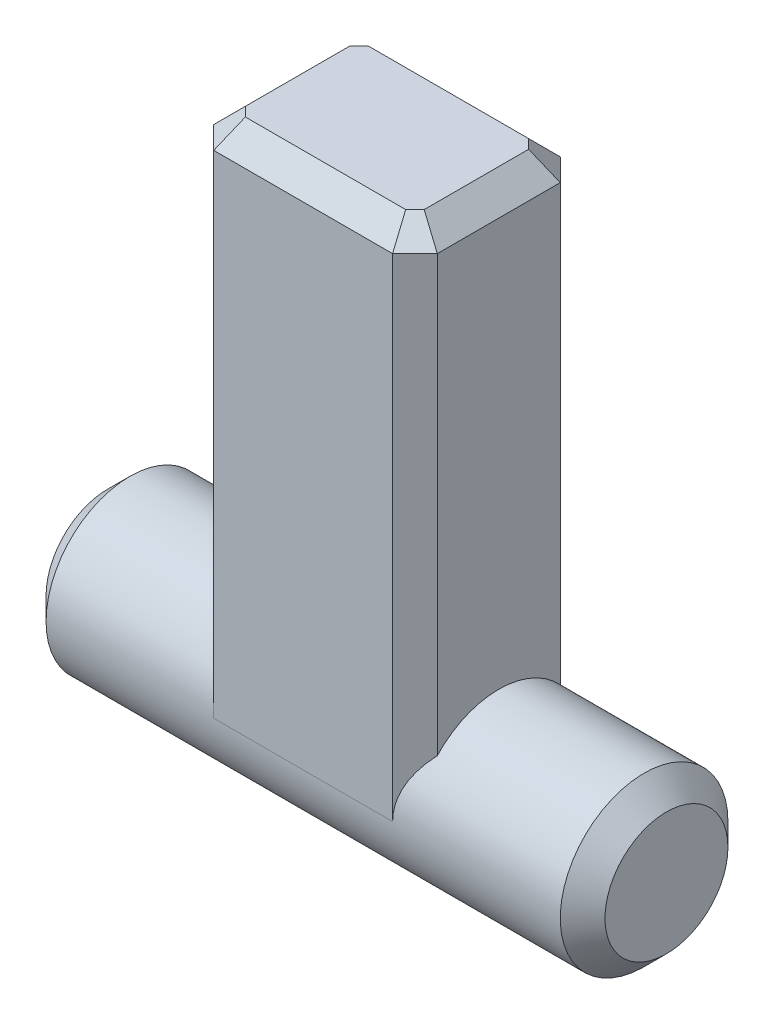
ISO-10303-21;
HEADER;
FILE_DESCRIPTION(('STEP AP214'),'2;1');
FILE_NAME('part.step','',(''),(''),'','','');
FILE_SCHEMA(('AUTOMOTIVE_DESIGN { 1 0 10303 214 1 1 1 1 }'));
ENDSEC;
DATA;
#1=APPLICATION_CONTEXT('core data for automotive mechanical design processes');
#2=APPLICATION_PROTOCOL_DEFINITION('international standard','automotive_design',2000,#1);
#3=PRODUCT_CONTEXT('',#1,'mechanical');
#4=PRODUCT('Part','Part','',(#3));
#5=PRODUCT_RELATED_PRODUCT_CATEGORY('part','',(#4));
#6=PRODUCT_DEFINITION_FORMATION('','',#4);
#7=PRODUCT_DEFINITION_CONTEXT('part definition',#1,'design');
#8=PRODUCT_DEFINITION('design','',#6,#7);
#9=PRODUCT_DEFINITION_SHAPE('','',#8);
#10=(LENGTH_UNIT() NAMED_UNIT(*) SI_UNIT(.MILLI.,.METRE.));
#11=(NAMED_UNIT(*) PLANE_ANGLE_UNIT() SI_UNIT($,.RADIAN.));
#12=(NAMED_UNIT(*) SI_UNIT($,.STERADIAN.) SOLID_ANGLE_UNIT());
#13=UNCERTAINTY_MEASURE_WITH_UNIT(LENGTH_MEASURE(1.E-05),#10,'distance_accuracy_value','');
#14=(GEOMETRIC_REPRESENTATION_CONTEXT(3) GLOBAL_UNCERTAINTY_ASSIGNED_CONTEXT((#13)) GLOBAL_UNIT_ASSIGNED_CONTEXT((#10,
#11,#12)) REPRESENTATION_CONTEXT('',''));
#15=CARTESIAN_POINT('',(0.,0.,0.));
#16=DIRECTION('',(0.,0.,1.));
#17=DIRECTION('',(1.,0.,0.));
#18=AXIS2_PLACEMENT_3D('',#15,#16,#17);
#19=CARTESIAN_POINT('',(-2.,0.,44.5));
#20=DIRECTION('',(0.,0.,-1.));
#21=DIRECTION('',(-1.,0.,0.));
#22=AXIS2_PLACEMENT_3D('',#19,#20,#21);
#23=PLANE('',#22);
#24=DIRECTION('',(0.,1.,0.));
#25=VECTOR('',#24,1.);
#26=CARTESIAN_POINT('',(1.60000000000001,6.2,44.5));
#27=LINE('',#26,#25);
#28=CARTESIAN_POINT('',(1.60000000000001,-3.,44.5));
#29=VERTEX_POINT('',#28);
#30=CARTESIAN_POINT('',(1.60000000000001,5.8,44.5));
#31=VERTEX_POINT('',#30);
#32=EDGE_CURVE('E152',#29,#31,#27,.T.);
#33=ORIENTED_EDGE('',*,*,#32,.T.);
#34=DIRECTION('',(-1.,0.,0.));
#35=VECTOR('',#34,1.);
#36=CARTESIAN_POINT('',(-1.6,5.8,44.5));
#37=LINE('',#36,#35);
#38=CARTESIAN_POINT('',(-1.6,5.8,44.5));
#39=VERTEX_POINT('',#38);
#40=EDGE_CURVE('E146',#31,#39,#37,.T.);
#41=ORIENTED_EDGE('',*,*,#40,.T.);
#42=DIRECTION('',(0.,-1.,0.));
#43=VECTOR('',#42,1.);
#44=CARTESIAN_POINT('',(-1.6,0.,44.5));
#45=LINE('',#44,#43);
#46=CARTESIAN_POINT('',(-1.6,-3.,44.5));
#47=VERTEX_POINT('',#46);
#48=EDGE_CURVE('E142',#39,#47,#45,.T.);
#49=ORIENTED_EDGE('',*,*,#48,.T.);
#50=DIRECTION('',(1.,0.,0.));
#51=VECTOR('',#50,1.);
#52=CARTESIAN_POINT('',(-2.,-3.,44.5));
#53=LINE('',#52,#51);
#54=EDGE_CURVE('E144',#47,#29,#53,.T.);
#55=ORIENTED_EDGE('',*,*,#54,.T.);
#56=EDGE_LOOP('',(#33,#41,#49,#55));
#57=FACE_BOUND('',#56,.T.);
#58=ADVANCED_FACE('F49',(#57),#23,.F.);
#59=CARTESIAN_POINT('',(-2.,0.,41.5));
#60=DIRECTION('',(0.,0.,-1.));
#61=DIRECTION('',(-1.,0.,0.));
#62=AXIS2_PLACEMENT_3D('',#59,#60,#61);
#63=PLANE('',#62);
#64=DIRECTION('',(0.,1.,0.));
#65=VECTOR('',#64,1.);
#66=CARTESIAN_POINT('',(-1.60000000000001,6.2,41.5));
#67=LINE('',#66,#65);
#68=CARTESIAN_POINT('',(-1.60000000000001,-3.,41.5));
#69=VERTEX_POINT('',#68);
#70=CARTESIAN_POINT('',(-1.60000000000001,5.8,41.5));
#71=VERTEX_POINT('',#70);
#72=EDGE_CURVE('E179',#69,#71,#67,.T.);
#73=ORIENTED_EDGE('',*,*,#72,.T.);
#74=DIRECTION('',(1.,0.,0.));
#75=VECTOR('',#74,1.);
#76=CARTESIAN_POINT('',(-2.,5.8,41.5));
#77=LINE('',#76,#75);
#78=CARTESIAN_POINT('',(1.6,5.8,41.5));
#79=VERTEX_POINT('',#78);
#80=EDGE_CURVE('E218',#71,#79,#77,.T.);
#81=ORIENTED_EDGE('',*,*,#80,.T.);
#82=DIRECTION('',(0.,-1.,0.));
#83=VECTOR('',#82,1.);
#84=CARTESIAN_POINT('',(1.6,0.,41.5));
#85=LINE('',#84,#83);
#86=CARTESIAN_POINT('',(1.6,-3.,41.5));
#87=VERTEX_POINT('',#86);
#88=EDGE_CURVE('E403',#79,#87,#85,.T.);
#89=ORIENTED_EDGE('',*,*,#88,.T.);
#90=DIRECTION('',(1.,0.,0.));
#91=VECTOR('',#90,1.);
#92=CARTESIAN_POINT('',(-2.,-3.,41.5));
#93=LINE('',#92,#91);
#94=EDGE_CURVE('E153',#69,#87,#93,.T.);
#95=ORIENTED_EDGE('',*,*,#94,.F.);
#96=EDGE_LOOP('',(#73,#81,#89,#95));
#97=FACE_BOUND('',#96,.T.);
#98=ADVANCED_FACE('F294',(#97),#63,.T.);
#99=CARTESIAN_POINT('',(-2.,-3.,43.));
#100=DIRECTION('',(1.,0.,0.));
#101=DIRECTION('',(0.,0.,-1.));
#102=AXIS2_PLACEMENT_3D('',#99,#100,#101);
#103=CYLINDRICAL_SURFACE('',#102,1.5);
#104=CARTESIAN_POINT('',(4.6,-3.,43.));
#105=DIRECTION('',(1.,0.,0.));
#106=DIRECTION('',(0.,0.,-1.));
#107=AXIS2_PLACEMENT_3D('',#104,#105,#106);
#108=CIRCLE('',#107,1.5);
#109=CARTESIAN_POINT('',(4.6,-3.,41.5));
#110=VERTEX_POINT('',#109);
#111=EDGE_CURVE('E59',#110,#110,#108,.F.);
#112=ORIENTED_EDGE('',*,*,#111,.T.);
#113=EDGE_LOOP('',(#112));
#114=FACE_BOUND('',#113,.T.);
#115=CARTESIAN_POINT('',(-4.60000000000001,-3.,43.));
#116=DIRECTION('',(-1.,0.,0.));
#117=DIRECTION('',(0.,0.,1.));
#118=AXIS2_PLACEMENT_3D('',#115,#116,#117);
#119=CIRCLE('',#118,1.5);
#120=CARTESIAN_POINT('',(-4.60000000000001,-3.,44.5));
#121=VERTEX_POINT('',#120);
#122=EDGE_CURVE('E264',#121,#121,#119,.F.);
#123=ORIENTED_EDGE('',*,*,#122,.T.);
#124=EDGE_LOOP('',(#123));
#125=FACE_BOUND('',#124,.T.);
#126=CARTESIAN_POINT('',(-2.,-3.,43.));
#127=DIRECTION('',(1.,0.,0.));
#128=DIRECTION('',(0.,0.,-1.));
#129=AXIS2_PLACEMENT_3D('',#126,#127,#128);
#130=CIRCLE('',#129,1.5);
#131=CARTESIAN_POINT('',(-2.,-1.98019609728144,41.9));
#132=VERTEX_POINT('',#131);
#133=CARTESIAN_POINT('',(-2.,-1.98019609728144,44.1));
#134=VERTEX_POINT('',#133);
#135=EDGE_CURVE('E260',#132,#134,#130,.T.);
#136=ORIENTED_EDGE('',*,*,#135,.F.);
#137=CARTESIAN_POINT('',(-3.09999999999999,-3.,43.));
#138=DIRECTION('',(-0.707106781186551,0.,-0.707106781186544));
#139=DIRECTION('',(0.707106781186544,0.,-0.707106781186551));
#140=AXIS2_PLACEMENT_3D('',#137,#138,#139);
#141=ELLIPSE('',#140,2.12132034355964,1.5);
#142=EDGE_CURVE('E171',#132,#69,#141,.T.);
#143=ORIENTED_EDGE('',*,*,#142,.T.);
#144=ORIENTED_EDGE('',*,*,#94,.T.);
#145=CARTESIAN_POINT('',(3.1,-3.,43.));
#146=DIRECTION('',(-0.707106781186548,0.,0.707106781186548));
#147=DIRECTION('',(0.707106781186548,0.,0.707106781186548));
#148=AXIS2_PLACEMENT_3D('',#145,#146,#147);
#149=ELLIPSE('',#148,2.12132034355965,1.5);
#150=CARTESIAN_POINT('',(2.,-1.98019609728144,41.9));
#151=VERTEX_POINT('',#150);
#152=EDGE_CURVE('E176',#87,#151,#149,.F.);
#153=ORIENTED_EDGE('',*,*,#152,.T.);
#154=CARTESIAN_POINT('',(2.,-3.,43.));
#155=DIRECTION('',(1.,0.,0.));
#156=DIRECTION('',(0.,0.,-1.));
#157=AXIS2_PLACEMENT_3D('',#154,#155,#156);
#158=CIRCLE('',#157,1.5);
#159=CARTESIAN_POINT('',(2.,-1.98019609728144,44.1));
#160=VERTEX_POINT('',#159);
#161=EDGE_CURVE('E164',#151,#160,#158,.T.);
#162=ORIENTED_EDGE('',*,*,#161,.T.);
#163=CARTESIAN_POINT('',(3.1,-3.,43.));
#164=DIRECTION('',(0.707106781186551,0.,0.707106781186544));
#165=DIRECTION('',(0.707106781186544,0.,-0.707106781186551));
#166=AXIS2_PLACEMENT_3D('',#163,#164,#165);
#167=ELLIPSE('',#166,2.12132034355964,1.5);
#168=EDGE_CURVE('E162',#160,#29,#167,.T.);
#169=ORIENTED_EDGE('',*,*,#168,.T.);
#170=ORIENTED_EDGE('',*,*,#54,.F.);
#171=CARTESIAN_POINT('',(-3.1,-3.,43.));
#172=DIRECTION('',(0.707106781186548,0.,-0.707106781186548));
#173=DIRECTION('',(0.707106781186548,0.,0.707106781186548));
#174=AXIS2_PLACEMENT_3D('',#171,#172,#173);
#175=ELLIPSE('',#174,2.12132034355965,1.5);
#176=EDGE_CURVE('E158',#47,#134,#175,.F.);
#177=ORIENTED_EDGE('',*,*,#176,.T.);
#178=EDGE_LOOP('',(#136,#143,#144,#153,#162,#169,#170,#177));
#179=FACE_BOUND('',#178,.T.);
#180=ADVANCED_FACE('F157',(#114,#125,#179),#103,.T.);
#181=CARTESIAN_POINT('',(-2.,0.,0.));
#182=DIRECTION('',(1.,0.,0.));
#183=DIRECTION('',(0.,0.,-1.));
#184=AXIS2_PLACEMENT_3D('',#181,#182,#183);
#185=PLANE('',#184);
#186=DIRECTION('',(0.,1.,0.));
#187=VECTOR('',#186,1.);
#188=CARTESIAN_POINT('',(-2.,0.,44.1));
#189=LINE('',#188,#187);
#190=CARTESIAN_POINT('',(-2.,5.8,44.1));
#191=VERTEX_POINT('',#190);
#192=EDGE_CURVE('E169',#134,#191,#189,.T.);
#193=ORIENTED_EDGE('',*,*,#192,.T.);
#194=DIRECTION('',(0.,0.,-1.));
#195=VECTOR('',#194,1.);
#196=CARTESIAN_POINT('',(-2.,5.8,41.9));
#197=LINE('',#196,#195);
#198=CARTESIAN_POINT('',(-2.,5.8,41.9));
#199=VERTEX_POINT('',#198);
#200=EDGE_CURVE('E212',#191,#199,#197,.T.);
#201=ORIENTED_EDGE('',*,*,#200,.T.);
#202=DIRECTION('',(0.,-1.,0.));
#203=VECTOR('',#202,1.);
#204=CARTESIAN_POINT('',(-2.,-3.,41.9));
#205=LINE('',#204,#203);
#206=EDGE_CURVE('E404',#199,#132,#205,.T.);
#207=ORIENTED_EDGE('',*,*,#206,.T.);
#208=ORIENTED_EDGE('',*,*,#135,.T.);
#209=EDGE_LOOP('',(#193,#201,#207,#208));
#210=FACE_BOUND('',#209,.T.);
#211=ADVANCED_FACE('F291',(#210),#185,.F.);
#212=CARTESIAN_POINT('',(2.,0.,0.));
#213=DIRECTION('',(1.,0.,0.));
#214=DIRECTION('',(0.,0.,-1.));
#215=AXIS2_PLACEMENT_3D('',#212,#213,#214);
#216=PLANE('',#215);
#217=DIRECTION('',(0.,1.,0.));
#218=VECTOR('',#217,1.);
#219=CARTESIAN_POINT('',(2.,0.,41.9));
#220=LINE('',#219,#218);
#221=CARTESIAN_POINT('',(2.,5.8,41.9));
#222=VERTEX_POINT('',#221);
#223=EDGE_CURVE('E622',#151,#222,#220,.T.);
#224=ORIENTED_EDGE('',*,*,#223,.T.);
#225=DIRECTION('',(0.,0.,1.));
#226=VECTOR('',#225,1.);
#227=CARTESIAN_POINT('',(2.,5.8,0.));
#228=LINE('',#227,#226);
#229=CARTESIAN_POINT('',(2.,5.8,44.1));
#230=VERTEX_POINT('',#229);
#231=EDGE_CURVE('E74',#222,#230,#228,.T.);
#232=ORIENTED_EDGE('',*,*,#231,.T.);
#233=DIRECTION('',(0.,-1.,0.));
#234=VECTOR('',#233,1.);
#235=CARTESIAN_POINT('',(2.,-3.,44.1));
#236=LINE('',#235,#234);
#237=EDGE_CURVE('E409',#230,#160,#236,.T.);
#238=ORIENTED_EDGE('',*,*,#237,.T.);
#239=ORIENTED_EDGE('',*,*,#161,.F.);
#240=EDGE_LOOP('',(#224,#232,#238,#239));
#241=FACE_BOUND('',#240,.T.);
#242=ADVANCED_FACE('F283',(#241),#216,.T.);
#243=CARTESIAN_POINT('',(5.,-3.,43.));
#244=DIRECTION('',(1.,0.,0.));
#245=DIRECTION('',(0.,0.,-1.));
#246=AXIS2_PLACEMENT_3D('',#243,#244,#245);
#247=PLANE('',#246);
#248=CARTESIAN_POINT('',(5.,-3.,43.));
#249=DIRECTION('',(1.,0.,0.));
#250=DIRECTION('',(0.,0.,-1.));
#251=AXIS2_PLACEMENT_3D('',#248,#249,#250);
#252=CIRCLE('',#251,1.1);
#253=CARTESIAN_POINT('',(5.,-3.,41.9));
#254=VERTEX_POINT('',#253);
#255=EDGE_CURVE('E229',#254,#254,#252,.T.);
#256=ORIENTED_EDGE('',*,*,#255,.T.);
#257=EDGE_LOOP('',(#256));
#258=FACE_BOUND('',#257,.T.);
#259=ADVANCED_FACE('F280',(#258),#247,.T.);
#260=CARTESIAN_POINT('',(-5.,-3.,43.));
#261=DIRECTION('',(-1.,0.,0.));
#262=DIRECTION('',(0.,0.,-1.));
#263=AXIS2_PLACEMENT_3D('',#260,#261,#262);
#264=PLANE('',#263);
#265=CARTESIAN_POINT('',(-5.,-3.,43.));
#266=DIRECTION('',(-1.,0.,0.));
#267=DIRECTION('',(0.,0.,1.));
#268=AXIS2_PLACEMENT_3D('',#265,#266,#267);
#269=CIRCLE('',#268,1.1);
#270=CARTESIAN_POINT('',(-5.,-3.,44.1));
#271=VERTEX_POINT('',#270);
#272=EDGE_CURVE('E11',#271,#271,#269,.T.);
#273=ORIENTED_EDGE('',*,*,#272,.T.);
#274=EDGE_LOOP('',(#273));
#275=FACE_BOUND('',#274,.T.);
#276=ADVANCED_FACE('F282',(#275),#264,.T.);
#277=CARTESIAN_POINT('',(0.,6.2,0.));
#278=DIRECTION('',(0.,1.,0.));
#279=DIRECTION('',(0.,0.,1.));
#280=AXIS2_PLACEMENT_3D('',#277,#278,#279);
#281=PLANE('',#280);
#282=DIRECTION('',(0.,0.,1.));
#283=VECTOR('',#282,1.);
#284=CARTESIAN_POINT('',(-1.6,6.2,44.1));
#285=LINE('',#284,#283);
#286=CARTESIAN_POINT('',(-1.6,6.2,42.0656854249492));
#287=VERTEX_POINT('',#286);
#288=CARTESIAN_POINT('',(-1.6,6.2,43.9343145750508));
#289=VERTEX_POINT('',#288);
#290=EDGE_CURVE('E202',#287,#289,#285,.T.);
#291=ORIENTED_EDGE('',*,*,#290,.T.);
#292=DIRECTION('',(0.707106781186548,0.,0.707106781186548));
#293=VECTOR('',#292,1.);
#294=CARTESIAN_POINT('',(-22.7671572875254,6.2,22.7671572875254));
#295=LINE('',#294,#293);
#296=CARTESIAN_POINT('',(-1.43431457505076,6.2,44.1));
#297=VERTEX_POINT('',#296);
#298=EDGE_CURVE('E205',#289,#297,#295,.T.);
#299=ORIENTED_EDGE('',*,*,#298,.T.);
#300=DIRECTION('',(1.,0.,0.));
#301=VECTOR('',#300,1.);
#302=CARTESIAN_POINT('',(1.60000000000001,6.2,44.1));
#303=LINE('',#302,#301);
#304=CARTESIAN_POINT('',(1.43431457505076,6.2,44.1));
#305=VERTEX_POINT('',#304);
#306=EDGE_CURVE('E185',#297,#305,#303,.T.);
#307=ORIENTED_EDGE('',*,*,#306,.T.);
#308=DIRECTION('',(0.707106781186544,0.,-0.707106781186551));
#309=VECTOR('',#308,1.);
#310=CARTESIAN_POINT('',(22.7671572875254,6.2,22.7671572875252));
#311=LINE('',#310,#309);
#312=CARTESIAN_POINT('',(1.6,6.2,43.9343145750508));
#313=VERTEX_POINT('',#312);
#314=EDGE_CURVE('E188',#305,#313,#311,.T.);
#315=ORIENTED_EDGE('',*,*,#314,.T.);
#316=DIRECTION('',(0.,0.,-1.));
#317=VECTOR('',#316,1.);
#318=CARTESIAN_POINT('',(1.6,6.2,0.));
#319=LINE('',#318,#317);
#320=CARTESIAN_POINT('',(1.6,6.2,42.0656854249492));
#321=VERTEX_POINT('',#320);
#322=EDGE_CURVE('E191',#313,#321,#319,.T.);
#323=ORIENTED_EDGE('',*,*,#322,.T.);
#324=DIRECTION('',(-0.707106781186548,0.,-0.707106781186548));
#325=VECTOR('',#324,1.);
#326=CARTESIAN_POINT('',(-20.2328427124746,6.2,20.2328427124746));
#327=LINE('',#326,#325);
#328=CARTESIAN_POINT('',(1.43431457505077,6.2,41.9));
#329=VERTEX_POINT('',#328);
#330=EDGE_CURVE('E193',#321,#329,#327,.T.);
#331=ORIENTED_EDGE('',*,*,#330,.T.);
#332=DIRECTION('',(-1.,0.,0.));
#333=VECTOR('',#332,1.);
#334=CARTESIAN_POINT('',(0.,6.2,41.9));
#335=LINE('',#334,#333);
#336=CARTESIAN_POINT('',(-1.43431457505076,6.2,41.9));
#337=VERTEX_POINT('',#336);
#338=EDGE_CURVE('E196',#329,#337,#335,.T.);
#339=ORIENTED_EDGE('',*,*,#338,.T.);
#340=DIRECTION('',(-0.707106781186544,0.,0.707106781186551));
#341=VECTOR('',#340,1.);
#342=CARTESIAN_POINT('',(20.2328427124746,6.2,20.2328427124744));
#343=LINE('',#342,#341);
#344=EDGE_CURVE('E199',#337,#287,#343,.T.);
#345=ORIENTED_EDGE('',*,*,#344,.T.);
#346=EDGE_LOOP('',(#291,#299,#307,#315,#323,#331,#339,#345));
#347=FACE_BOUND('',#346,.T.);
#348=ADVANCED_FACE('F288',(#347),#281,.T.);
#349=CARTESIAN_POINT('',(1.60000000000001,0.,44.5));
#350=DIRECTION('',(0.707106781186551,0.,0.707106781186544));
#351=DIRECTION('',(0.,-1.,0.));
#352=AXIS2_PLACEMENT_3D('',#349,#350,#351);
#353=PLANE('',#352);
#354=ORIENTED_EDGE('',*,*,#237,.F.);
#355=DIRECTION('',(-0.707106781186544,0.,0.707106781186551));
#356=VECTOR('',#355,1.);
#357=CARTESIAN_POINT('',(1.60000000000001,5.8,44.5));
#358=LINE('',#357,#356);
#359=EDGE_CURVE('E66',#230,#31,#358,.T.);
#360=ORIENTED_EDGE('',*,*,#359,.T.);
#361=ORIENTED_EDGE('',*,*,#32,.F.);
#362=ORIENTED_EDGE('',*,*,#168,.F.);
#363=EDGE_LOOP('',(#354,#360,#361,#362));
#364=FACE_BOUND('',#363,.T.);
#365=ADVANCED_FACE('F303',(#364),#353,.T.);
#366=CARTESIAN_POINT('',(-2.,0.,44.1));
#367=DIRECTION('',(0.707106781186548,0.,-0.707106781186548));
#368=DIRECTION('',(0.,1.,0.));
#369=AXIS2_PLACEMENT_3D('',#366,#367,#368);
#370=PLANE('',#369);
#371=ORIENTED_EDGE('',*,*,#48,.F.);
#372=DIRECTION('',(0.707106781186548,0.,0.707106781186548));
#373=VECTOR('',#372,1.);
#374=CARTESIAN_POINT('',(-2.,5.8,44.1));
#375=LINE('',#374,#373);
#376=EDGE_CURVE('E209',#39,#191,#375,.F.);
#377=ORIENTED_EDGE('',*,*,#376,.T.);
#378=ORIENTED_EDGE('',*,*,#192,.F.);
#379=ORIENTED_EDGE('',*,*,#176,.F.);
#380=EDGE_LOOP('',(#371,#377,#378,#379));
#381=FACE_BOUND('',#380,.T.);
#382=ADVANCED_FACE('F167',(#381),#370,.F.);
#383=CARTESIAN_POINT('',(-1.60000000000001,0.,41.5));
#384=DIRECTION('',(-0.707106781186551,0.,-0.707106781186544));
#385=DIRECTION('',(0.,-1.,0.));
#386=AXIS2_PLACEMENT_3D('',#383,#384,#385);
#387=PLANE('',#386);
#388=ORIENTED_EDGE('',*,*,#206,.F.);
#389=DIRECTION('',(0.707106781186544,0.,-0.707106781186551));
#390=VECTOR('',#389,1.);
#391=CARTESIAN_POINT('',(-1.60000000000001,5.8,41.5));
#392=LINE('',#391,#390);
#393=EDGE_CURVE('E215',#199,#71,#392,.T.);
#394=ORIENTED_EDGE('',*,*,#393,.T.);
#395=ORIENTED_EDGE('',*,*,#72,.F.);
#396=ORIENTED_EDGE('',*,*,#142,.F.);
#397=EDGE_LOOP('',(#388,#394,#395,#396));
#398=FACE_BOUND('',#397,.T.);
#399=ADVANCED_FACE('F314',(#398),#387,.T.);
#400=CARTESIAN_POINT('',(2.,0.,41.9));
#401=DIRECTION('',(-0.707106781186548,0.,0.707106781186548));
#402=DIRECTION('',(0.,1.,0.));
#403=AXIS2_PLACEMENT_3D('',#400,#401,#402);
#404=PLANE('',#403);
#405=ORIENTED_EDGE('',*,*,#88,.F.);
#406=DIRECTION('',(-0.707106781186548,0.,-0.707106781186548));
#407=VECTOR('',#406,1.);
#408=CARTESIAN_POINT('',(2.,5.8,41.9));
#409=LINE('',#408,#407);
#410=EDGE_CURVE('E221',#79,#222,#409,.F.);
#411=ORIENTED_EDGE('',*,*,#410,.T.);
#412=ORIENTED_EDGE('',*,*,#223,.F.);
#413=ORIENTED_EDGE('',*,*,#152,.F.);
#414=EDGE_LOOP('',(#405,#411,#412,#413));
#415=FACE_BOUND('',#414,.T.);
#416=ADVANCED_FACE('F320',(#415),#404,.F.);
#417=CARTESIAN_POINT('',(-20.2328427124746,6.2,20.2328427124746));
#418=DIRECTION('',(0.500000000000004,0.707106781186541,-0.500000000000004));
#419=DIRECTION('',(0.707106781186548,0.,0.707106781186548));
#420=AXIS2_PLACEMENT_3D('',#417,#418,#419);
#421=PLANE('',#420);
#422=DIRECTION('',(0.678598344545848,-0.678598344545851,-0.281084637714808));
#423=VECTOR('',#422,1.);
#424=CARTESIAN_POINT('',(9.62375900532326,-1.82375900532329,38.7421356237312));
#425=LINE('',#424,#423);
#426=EDGE_CURVE('E252',#222,#321,#425,.F.);
#427=ORIENTED_EDGE('',*,*,#426,.F.);
#428=ORIENTED_EDGE('',*,*,#410,.F.);
#429=DIRECTION('',(0.281084637714808,-0.678598344545851,-0.678598344545848));
#430=VECTOR('',#429,1.);
#431=CARTESIAN_POINT('',(3.85529431378151,0.355237880525488,36.0552378805255));
#432=LINE('',#431,#430);
#433=EDGE_CURVE('E256',#329,#79,#432,.T.);
#434=ORIENTED_EDGE('',*,*,#433,.F.);
#435=ORIENTED_EDGE('',*,*,#330,.F.);
#436=EDGE_LOOP('',(#427,#428,#434,#435));
#437=FACE_BOUND('',#436,.T.);
#438=ADVANCED_FACE('F327',(#437),#421,.T.);
#439=CARTESIAN_POINT('',(0.,6.2,41.9));
#440=DIRECTION('',(0.,-0.707106781186546,0.707106781186549));
#441=DIRECTION('',(-1.,0.,0.));
#442=AXIS2_PLACEMENT_3D('',#439,#440,#441);
#443=PLANE('',#442);
#444=ORIENTED_EDGE('',*,*,#433,.T.);
#445=ORIENTED_EDGE('',*,*,#80,.F.);
#446=DIRECTION('',(0.281084637714837,0.678598344545845,0.678598344545842));
#447=VECTOR('',#446,1.);
#448=CARTESIAN_POINT('',(-1.32099142644071,6.47358628230518,42.1735862823052));
#449=LINE('',#448,#447);
#450=EDGE_CURVE('E248',#337,#71,#449,.F.);
#451=ORIENTED_EDGE('',*,*,#450,.F.);
#452=ORIENTED_EDGE('',*,*,#338,.F.);
#453=EDGE_LOOP('',(#444,#445,#451,#452));
#454=FACE_BOUND('',#453,.T.);
#455=ADVANCED_FACE('F371',(#454),#443,.F.);
#456=CARTESIAN_POINT('',(1.6,6.2,0.));
#457=DIRECTION('',(-0.707106781186549,-0.707106781186546,0.));
#458=DIRECTION('',(0.,0.,-1.));
#459=AXIS2_PLACEMENT_3D('',#456,#457,#458);
#460=PLANE('',#459);
#461=ORIENTED_EDGE('',*,*,#426,.T.);
#462=ORIENTED_EDGE('',*,*,#322,.F.);
#463=DIRECTION('',(-0.678598344545844,0.678598344545847,-0.281084637714826));
#464=VECTOR('',#463,1.);
#465=CARTESIAN_POINT('',(7.3098860477792,0.490113952220776,46.2994268156459));
#466=LINE('',#465,#464);
#467=EDGE_CURVE('E244',#230,#313,#466,.T.);
#468=ORIENTED_EDGE('',*,*,#467,.F.);
#469=ORIENTED_EDGE('',*,*,#231,.F.);
#470=EDGE_LOOP('',(#461,#462,#468,#469));
#471=FACE_BOUND('',#470,.T.);
#472=ADVANCED_FACE('F364',(#471),#460,.F.);
#473=CARTESIAN_POINT('',(20.2328427124746,6.2,20.2328427124744));
#474=DIRECTION('',(0.499999999999999,-0.707106781186552,0.499999999999995));
#475=DIRECTION('',(-0.707106781186544,0.,0.707106781186551));
#476=AXIS2_PLACEMENT_3D('',#473,#474,#475);
#477=PLANE('',#476);
#478=ORIENTED_EDGE('',*,*,#450,.T.);
#479=ORIENTED_EDGE('',*,*,#393,.F.);
#480=DIRECTION('',(-0.678598344545843,-0.678598344545846,-0.281084637714833));
#481=VECTOR('',#480,1.);
#482=CARTESIAN_POINT('',(4.28945611798246,12.0894561179825,44.5051780240189));
#483=LINE('',#482,#481);
#484=EDGE_CURVE('E240',#287,#199,#483,.T.);
#485=ORIENTED_EDGE('',*,*,#484,.F.);
#486=ORIENTED_EDGE('',*,*,#344,.F.);
#487=EDGE_LOOP('',(#478,#479,#485,#486));
#488=FACE_BOUND('',#487,.T.);
#489=ADVANCED_FACE('F357',(#488),#477,.F.);
#490=CARTESIAN_POINT('',(22.7671572875254,6.2,22.7671572875252));
#491=DIRECTION('',(-0.500000000000001,-0.707106781186549,-0.499999999999997));
#492=DIRECTION('',(0.707106781186544,0.,-0.707106781186551));
#493=AXIS2_PLACEMENT_3D('',#490,#491,#492);
#494=PLANE('',#493);
#495=ORIENTED_EDGE('',*,*,#467,.T.);
#496=ORIENTED_EDGE('',*,*,#314,.F.);
#497=DIRECTION('',(0.281084637714829,-0.678598344545847,0.678598344545844));
#498=VECTOR('',#497,1.);
#499=CARTESIAN_POINT('',(1.32099142644072,6.47358628230517,43.8264137176948));
#500=LINE('',#499,#498);
#501=EDGE_CURVE('E236',#31,#305,#500,.F.);
#502=ORIENTED_EDGE('',*,*,#501,.F.);
#503=ORIENTED_EDGE('',*,*,#359,.F.);
#504=EDGE_LOOP('',(#495,#496,#502,#503));
#505=FACE_BOUND('',#504,.T.);
#506=ADVANCED_FACE('F350',(#505),#494,.F.);
#507=CARTESIAN_POINT('',(-1.6,6.2,0.));
#508=DIRECTION('',(-0.707106781186549,0.707106781186546,0.));
#509=DIRECTION('',(0.,0.,-1.));
#510=AXIS2_PLACEMENT_3D('',#507,#508,#509);
#511=PLANE('',#510);
#512=ORIENTED_EDGE('',*,*,#484,.T.);
#513=ORIENTED_EDGE('',*,*,#200,.F.);
#514=DIRECTION('',(0.678598344545844,0.678598344545847,-0.281084637714827));
#515=VECTOR('',#514,1.);
#516=CARTESIAN_POINT('',(6.78018800010355,14.5801880001036,40.4631270501715));
#517=LINE('',#516,#515);
#518=EDGE_CURVE('E233',#289,#191,#517,.F.);
#519=ORIENTED_EDGE('',*,*,#518,.F.);
#520=ORIENTED_EDGE('',*,*,#290,.F.);
#521=EDGE_LOOP('',(#512,#513,#519,#520));
#522=FACE_BOUND('',#521,.T.);
#523=ADVANCED_FACE('F343',(#522),#511,.T.);
#524=CARTESIAN_POINT('',(0.,6.2,44.1));
#525=DIRECTION('',(0.,0.707106781186546,0.707106781186549));
#526=DIRECTION('',(-1.,0.,0.));
#527=AXIS2_PLACEMENT_3D('',#524,#525,#526);
#528=PLANE('',#527);
#529=ORIENTED_EDGE('',*,*,#501,.T.);
#530=ORIENTED_EDGE('',*,*,#306,.F.);
#531=DIRECTION('',(-0.281084637714827,-0.678598344545847,0.678598344545844));
#532=VECTOR('',#531,1.);
#533=CARTESIAN_POINT('',(-1.32099142644072,6.47358628230517,43.8264137176948));
#534=LINE('',#533,#532);
#535=EDGE_CURVE('E230',#39,#297,#534,.F.);
#536=ORIENTED_EDGE('',*,*,#535,.F.);
#537=ORIENTED_EDGE('',*,*,#40,.F.);
#538=EDGE_LOOP('',(#529,#530,#536,#537));
#539=FACE_BOUND('',#538,.T.);
#540=ADVANCED_FACE('F336',(#539),#528,.T.);
#541=CARTESIAN_POINT('',(-22.7671572875254,6.2,22.7671572875254));
#542=DIRECTION('',(-0.499999999999999,0.707106781186549,0.499999999999999));
#543=DIRECTION('',(-0.707106781186548,0.,-0.707106781186548));
#544=AXIS2_PLACEMENT_3D('',#541,#542,#543);
#545=PLANE('',#544);
#546=ORIENTED_EDGE('',*,*,#518,.T.);
#547=ORIENTED_EDGE('',*,*,#376,.F.);
#548=ORIENTED_EDGE('',*,*,#535,.T.);
#549=ORIENTED_EDGE('',*,*,#298,.F.);
#550=EDGE_LOOP('',(#546,#547,#548,#549));
#551=FACE_BOUND('',#550,.T.);
#552=ADVANCED_FACE('F277',(#551),#545,.T.);
#553=CARTESIAN_POINT('',(5.,-3.,43.));
#554=DIRECTION('',(-1.,0.,0.));
#555=DIRECTION('',(0.,0.,1.));
#556=AXIS2_PLACEMENT_3D('',#553,#554,#555);
#557=CONICAL_SURFACE('',#556,1.1,0.785398163397448);
#558=ORIENTED_EDGE('',*,*,#111,.F.);
#559=EDGE_LOOP('',(#558));
#560=FACE_BOUND('',#559,.T.);
#561=ORIENTED_EDGE('',*,*,#255,.F.);
#562=EDGE_LOOP('',(#561));
#563=FACE_BOUND('',#562,.T.);
#564=ADVANCED_FACE('F274',(#560,#563),#557,.T.);
#565=CARTESIAN_POINT('',(-4.60000000000001,-3.,43.));
#566=DIRECTION('',(1.,0.,0.));
#567=DIRECTION('',(0.,0.,-1.));
#568=AXIS2_PLACEMENT_3D('',#565,#566,#567);
#569=CONICAL_SURFACE('',#568,1.5,0.785398163397456);
#570=ORIENTED_EDGE('',*,*,#272,.F.);
#571=EDGE_LOOP('',(#570));
#572=FACE_BOUND('',#571,.T.);
#573=ORIENTED_EDGE('',*,*,#122,.F.);
#574=EDGE_LOOP('',(#573));
#575=FACE_BOUND('',#574,.T.);
#576=ADVANCED_FACE('F52',(#572,#575),#569,.T.);
#577=CLOSED_SHELL('',(#58,#98,#180,#211,#242,#259,#276,#348,#365,#382,#399,#416,#438,#455,#472,
#489,#506,#523,#540,#552,#564,#576));
#578=MANIFOLD_SOLID_BREP('B2',#577);
#579=ADVANCED_BREP_SHAPE_REPRESENTATION('',(#18,#578),#14);
#580=SHAPE_DEFINITION_REPRESENTATION(#9,#579);
ENDSEC;
END-ISO-10303-21;
